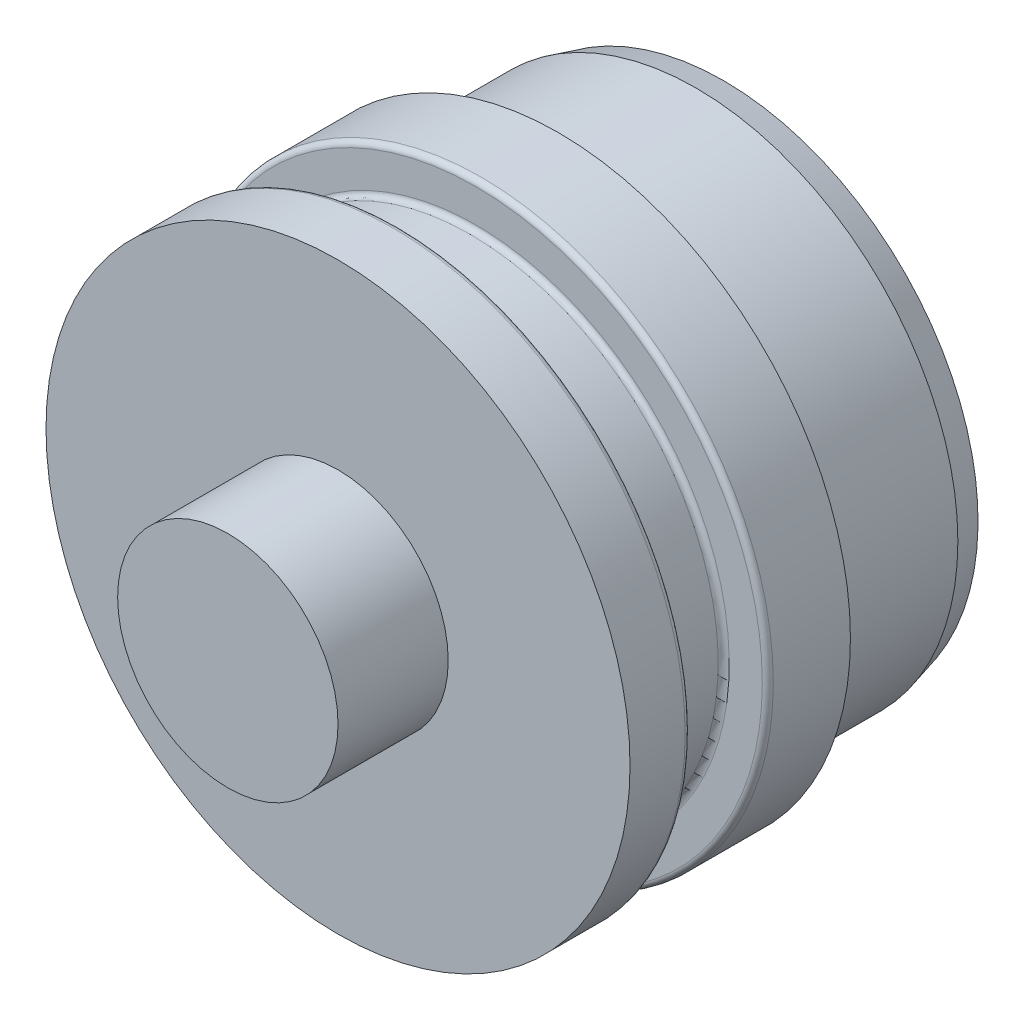
ISO-10303-21;
HEADER;
FILE_DESCRIPTION(('STEP AP214'),'2;1');
FILE_NAME('part.step','',(''),(''),'','','');
FILE_SCHEMA(('AUTOMOTIVE_DESIGN { 1 0 10303 214 1 1 1 1 }'));
ENDSEC;
DATA;
#1=APPLICATION_CONTEXT('core data for automotive mechanical design processes');
#2=APPLICATION_PROTOCOL_DEFINITION('international standard','automotive_design',2000,#1);
#3=PRODUCT_CONTEXT('',#1,'mechanical');
#4=PRODUCT('Part','Part','',(#3));
#5=PRODUCT_RELATED_PRODUCT_CATEGORY('part','',(#4));
#6=PRODUCT_DEFINITION_FORMATION('','',#4);
#7=PRODUCT_DEFINITION_CONTEXT('part definition',#1,'design');
#8=PRODUCT_DEFINITION('design','',#6,#7);
#9=PRODUCT_DEFINITION_SHAPE('','',#8);
#10=(LENGTH_UNIT() NAMED_UNIT(*) SI_UNIT(.MILLI.,.METRE.));
#11=(NAMED_UNIT(*) PLANE_ANGLE_UNIT() SI_UNIT($,.RADIAN.));
#12=(NAMED_UNIT(*) SI_UNIT($,.STERADIAN.) SOLID_ANGLE_UNIT());
#13=UNCERTAINTY_MEASURE_WITH_UNIT(LENGTH_MEASURE(1.E-05),#10,'distance_accuracy_value','');
#14=(GEOMETRIC_REPRESENTATION_CONTEXT(3) GLOBAL_UNCERTAINTY_ASSIGNED_CONTEXT((#13)) GLOBAL_UNIT_ASSIGNED_CONTEXT((#10,
#11,#12)) REPRESENTATION_CONTEXT('',''));
#15=CARTESIAN_POINT('',(0.,0.,0.));
#16=DIRECTION('',(0.,0.,1.));
#17=DIRECTION('',(1.,0.,0.));
#18=AXIS2_PLACEMENT_3D('',#15,#16,#17);
#19=CARTESIAN_POINT('',(0.,0.,-5.08));
#20=DIRECTION('',(0.,0.,-1.));
#21=DIRECTION('',(0.,1.,0.));
#22=AXIS2_PLACEMENT_3D('',#19,#20,#21);
#23=CYLINDRICAL_SURFACE('',#22,12.065);
#24=CARTESIAN_POINT('',(0.,0.,-16.51));
#25=DIRECTION('',(0.,0.,-1.));
#26=DIRECTION('',(0.,1.,0.));
#27=AXIS2_PLACEMENT_3D('',#24,#25,#26);
#28=CIRCLE('',#27,12.065);
#29=CARTESIAN_POINT('',(0.,12.065,-16.51));
#30=VERTEX_POINT('',#29);
#31=EDGE_CURVE('E99',#30,#30,#28,.F.);
#32=ORIENTED_EDGE('',*,*,#31,.T.);
#33=EDGE_LOOP('',(#32));
#34=FACE_BOUND('',#33,.T.);
#35=CARTESIAN_POINT('',(0.,0.,-10.16));
#36=DIRECTION('',(0.,0.,-1.));
#37=DIRECTION('',(0.,1.,0.));
#38=AXIS2_PLACEMENT_3D('',#35,#36,#37);
#39=CIRCLE('',#38,12.065);
#40=CARTESIAN_POINT('',(0.,12.065,-10.16));
#41=VERTEX_POINT('',#40);
#42=EDGE_CURVE('E123',#41,#41,#39,.T.);
#43=ORIENTED_EDGE('',*,*,#42,.T.);
#44=EDGE_LOOP('',(#43));
#45=FACE_BOUND('',#44,.T.);
#46=ADVANCED_FACE('F67',(#34,#45),#23,.T.);
#47=CARTESIAN_POINT('',(0.,12.065,-17.78));
#48=DIRECTION('',(0.,0.,-1.));
#49=DIRECTION('',(0.,1.,0.));
#50=AXIS2_PLACEMENT_3D('',#47,#48,#49);
#51=PLANE('',#50);
#52=CARTESIAN_POINT('',(0.,0.,-17.78));
#53=DIRECTION('',(0.,0.,-1.));
#54=DIRECTION('',(0.,1.,0.));
#55=AXIS2_PLACEMENT_3D('',#52,#53,#54);
#56=CIRCLE('',#55,11.7247045256125);
#57=CARTESIAN_POINT('',(0.,11.7247045256125,-17.78));
#58=VERTEX_POINT('',#57);
#59=EDGE_CURVE('E102',#58,#58,#56,.T.);
#60=ORIENTED_EDGE('',*,*,#59,.T.);
#61=EDGE_LOOP('',(#60));
#62=FACE_BOUND('',#61,.T.);
#63=CARTESIAN_POINT('',(0.,0.,-17.78));
#64=DIRECTION('',(0.,0.,-1.));
#65=DIRECTION('',(0.,1.,0.));
#66=AXIS2_PLACEMENT_3D('',#63,#64,#65);
#67=CIRCLE('',#66,6.731);
#68=CARTESIAN_POINT('',(0.,6.731,-17.78));
#69=VERTEX_POINT('',#68);
#70=EDGE_CURVE('E105',#69,#69,#67,.T.);
#71=ORIENTED_EDGE('',*,*,#70,.F.);
#72=EDGE_LOOP('',(#71));
#73=FACE_BOUND('',#72,.T.);
#74=ADVANCED_FACE('F144',(#62,#73),#51,.T.);
#75=CARTESIAN_POINT('',(0.,0.,-5.08));
#76=DIRECTION('',(0.,0.,-1.));
#77=DIRECTION('',(0.,1.,0.));
#78=AXIS2_PLACEMENT_3D('',#75,#76,#77);
#79=CYLINDRICAL_SURFACE('',#78,6.731);
#80=ORIENTED_EDGE('',*,*,#70,.T.);
#81=EDGE_LOOP('',(#80));
#82=FACE_BOUND('',#81,.T.);
#83=CARTESIAN_POINT('',(0.,0.,-5.08));
#84=DIRECTION('',(0.,0.,-1.));
#85=DIRECTION('',(0.,1.,0.));
#86=AXIS2_PLACEMENT_3D('',#83,#84,#85);
#87=CIRCLE('',#86,6.731);
#88=CARTESIAN_POINT('',(0.,6.731,-5.08));
#89=VERTEX_POINT('',#88);
#90=EDGE_CURVE('E108',#89,#89,#87,.T.);
#91=ORIENTED_EDGE('',*,*,#90,.F.);
#92=EDGE_LOOP('',(#91));
#93=FACE_BOUND('',#92,.T.);
#94=ADVANCED_FACE('F150',(#82,#93),#79,.F.);
#95=CARTESIAN_POINT('',(0.,6.731,-5.08));
#96=DIRECTION('',(0.,0.,-1.));
#97=DIRECTION('',(0.,1.,0.));
#98=AXIS2_PLACEMENT_3D('',#95,#96,#97);
#99=PLANE('',#98);
#100=ORIENTED_EDGE('',*,*,#90,.T.);
#101=EDGE_LOOP('',(#100));
#102=FACE_BOUND('',#101,.T.);
#103=ADVANCED_FACE('F199',(#102),#99,.T.);
#104=CARTESIAN_POINT('',(0.,5.08,5.08));
#105=DIRECTION('',(0.,0.,1.));
#106=DIRECTION('',(0.,-1.,0.));
#107=AXIS2_PLACEMENT_3D('',#104,#105,#106);
#108=PLANE('',#107);
#109=CARTESIAN_POINT('',(0.,0.,5.08));
#110=DIRECTION('',(0.,0.,-1.));
#111=DIRECTION('',(0.,1.,0.));
#112=AXIS2_PLACEMENT_3D('',#109,#110,#111);
#113=CIRCLE('',#112,5.08);
#114=CARTESIAN_POINT('',(0.,5.08,5.08));
#115=VERTEX_POINT('',#114);
#116=EDGE_CURVE('E111',#115,#115,#113,.T.);
#117=ORIENTED_EDGE('',*,*,#116,.F.);
#118=EDGE_LOOP('',(#117));
#119=FACE_BOUND('',#118,.T.);
#120=ADVANCED_FACE('F195',(#119),#108,.T.);
#121=CARTESIAN_POINT('',(0.,0.,-5.08));
#122=DIRECTION('',(0.,0.,-1.));
#123=DIRECTION('',(0.,1.,0.));
#124=AXIS2_PLACEMENT_3D('',#121,#122,#123);
#125=CYLINDRICAL_SURFACE('',#124,5.08);
#126=ORIENTED_EDGE('',*,*,#116,.T.);
#127=EDGE_LOOP('',(#126));
#128=FACE_BOUND('',#127,.T.);
#129=CARTESIAN_POINT('',(0.,0.,0.));
#130=DIRECTION('',(0.,0.,-1.));
#131=DIRECTION('',(0.,1.,0.));
#132=AXIS2_PLACEMENT_3D('',#129,#130,#131);
#133=CIRCLE('',#132,5.08);
#134=CARTESIAN_POINT('',(0.,5.08,0.));
#135=VERTEX_POINT('',#134);
#136=EDGE_CURVE('E114',#135,#135,#133,.T.);
#137=ORIENTED_EDGE('',*,*,#136,.F.);
#138=EDGE_LOOP('',(#137));
#139=FACE_BOUND('',#138,.T.);
#140=ADVANCED_FACE('F191',(#128,#139),#125,.T.);
#141=CARTESIAN_POINT('',(0.,5.08,0.));
#142=DIRECTION('',(0.,0.,1.));
#143=DIRECTION('',(0.,-1.,0.));
#144=AXIS2_PLACEMENT_3D('',#141,#142,#143);
#145=PLANE('',#144);
#146=ORIENTED_EDGE('',*,*,#136,.T.);
#147=EDGE_LOOP('',(#146));
#148=FACE_BOUND('',#147,.T.);
#149=CARTESIAN_POINT('',(0.,0.,0.));
#150=DIRECTION('',(0.,0.,-1.));
#151=DIRECTION('',(0.,1.,0.));
#152=AXIS2_PLACEMENT_3D('',#149,#150,#151);
#153=CIRCLE('',#152,13.462);
#154=CARTESIAN_POINT('',(0.,13.462,0.));
#155=VERTEX_POINT('',#154);
#156=EDGE_CURVE('E117',#155,#155,#153,.T.);
#157=ORIENTED_EDGE('',*,*,#156,.F.);
#158=EDGE_LOOP('',(#157));
#159=FACE_BOUND('',#158,.T.);
#160=ADVANCED_FACE('F187',(#148,#159),#145,.T.);
#161=CARTESIAN_POINT('',(0.,0.,-5.08));
#162=DIRECTION('',(0.,0.,-1.));
#163=DIRECTION('',(0.,1.,0.));
#164=AXIS2_PLACEMENT_3D('',#161,#162,#163);
#165=CYLINDRICAL_SURFACE('',#164,13.462);
#166=CARTESIAN_POINT('',(0.,0.,-2.54));
#167=DIRECTION('',(0.,0.,-1.));
#168=DIRECTION('',(0.,1.,0.));
#169=AXIS2_PLACEMENT_3D('',#166,#167,#168);
#170=CIRCLE('',#169,13.462);
#171=CARTESIAN_POINT('',(0.,13.462,-2.54));
#172=VERTEX_POINT('',#171);
#173=EDGE_CURVE('E90',#172,#172,#170,.F.);
#174=ORIENTED_EDGE('',*,*,#173,.T.);
#175=EDGE_LOOP('',(#174));
#176=FACE_BOUND('',#175,.T.);
#177=ORIENTED_EDGE('',*,*,#156,.T.);
#178=EDGE_LOOP('',(#177));
#179=FACE_BOUND('',#178,.T.);
#180=ADVANCED_FACE('F181',(#176,#179),#165,.T.);
#181=CARTESIAN_POINT('',(0.,13.462,-2.794));
#182=DIRECTION('',(0.,0.,-1.));
#183=DIRECTION('',(0.,1.,0.));
#184=AXIS2_PLACEMENT_3D('',#181,#182,#183);
#185=PLANE('',#184);
#186=CARTESIAN_POINT('',(0.,0.,-2.794));
#187=DIRECTION('',(0.,0.,-1.));
#188=DIRECTION('',(0.,1.,0.));
#189=AXIS2_PLACEMENT_3D('',#186,#187,#188);
#190=CIRCLE('',#189,13.208);
#191=CARTESIAN_POINT('',(0.,13.208,-2.794));
#192=VERTEX_POINT('',#191);
#193=EDGE_CURVE('E93',#192,#192,#190,.T.);
#194=ORIENTED_EDGE('',*,*,#193,.T.);
#195=EDGE_LOOP('',(#194));
#196=FACE_BOUND('',#195,.T.);
#197=CARTESIAN_POINT('',(0.,0.,-2.794));
#198=DIRECTION('',(0.,0.,-1.));
#199=DIRECTION('',(0.,1.,0.));
#200=AXIS2_PLACEMENT_3D('',#197,#198,#199);
#201=CIRCLE('',#200,11.684);
#202=CARTESIAN_POINT('',(0.,11.684,-2.794));
#203=VERTEX_POINT('',#202);
#204=EDGE_CURVE('E96',#203,#203,#201,.F.);
#205=ORIENTED_EDGE('',*,*,#204,.T.);
#206=EDGE_LOOP('',(#205));
#207=FACE_BOUND('',#206,.T.);
#208=ADVANCED_FACE('F173',(#196,#207),#185,.T.);
#209=CARTESIAN_POINT('',(0.,0.,-5.08));
#210=DIRECTION('',(0.,0.,-1.));
#211=DIRECTION('',(0.,1.,0.));
#212=AXIS2_PLACEMENT_3D('',#209,#210,#211);
#213=CYLINDRICAL_SURFACE('',#212,11.43);
#214=CARTESIAN_POINT('',(0.,0.,-3.048));
#215=DIRECTION('',(0.,0.,-1.));
#216=DIRECTION('',(0.,1.,0.));
#217=AXIS2_PLACEMENT_3D('',#214,#215,#216);
#218=CIRCLE('',#217,11.43);
#219=CARTESIAN_POINT('',(0.,11.43,-3.048));
#220=VERTEX_POINT('',#219);
#221=EDGE_CURVE('E82',#220,#220,#218,.T.);
#222=ORIENTED_EDGE('',*,*,#221,.T.);
#223=EDGE_LOOP('',(#222));
#224=FACE_BOUND('',#223,.T.);
#225=CARTESIAN_POINT('',(0.,0.,-6.096));
#226=DIRECTION('',(0.,0.,1.));
#227=DIRECTION('',(0.,-1.,0.));
#228=AXIS2_PLACEMENT_3D('',#225,#226,#227);
#229=CIRCLE('',#228,11.43);
#230=CARTESIAN_POINT('',(0.,-11.43,-6.096));
#231=VERTEX_POINT('',#230);
#232=EDGE_CURVE('E87',#231,#231,#229,.T.);
#233=ORIENTED_EDGE('',*,*,#232,.T.);
#234=EDGE_LOOP('',(#233));
#235=FACE_BOUND('',#234,.T.);
#236=ADVANCED_FACE('F171',(#224,#235),#213,.T.);
#237=CARTESIAN_POINT('',(0.,11.43,-6.35));
#238=DIRECTION('',(0.,0.,1.));
#239=DIRECTION('',(0.,-1.,0.));
#240=AXIS2_PLACEMENT_3D('',#237,#238,#239);
#241=PLANE('',#240);
#242=CARTESIAN_POINT('',(0.,0.,-6.35));
#243=DIRECTION('',(0.,0.,1.));
#244=DIRECTION('',(0.,-1.,0.));
#245=AXIS2_PLACEMENT_3D('',#242,#243,#244);
#246=CIRCLE('',#245,11.684);
#247=CARTESIAN_POINT('',(0.,-11.684,-6.35));
#248=VERTEX_POINT('',#247);
#249=EDGE_CURVE('E74',#248,#248,#246,.F.);
#250=ORIENTED_EDGE('',*,*,#249,.T.);
#251=EDGE_LOOP('',(#250));
#252=FACE_BOUND('',#251,.T.);
#253=CARTESIAN_POINT('',(0.,0.,-6.35));
#254=DIRECTION('',(0.,0.,1.));
#255=DIRECTION('',(0.,-1.,0.));
#256=AXIS2_PLACEMENT_3D('',#253,#254,#255);
#257=CIRCLE('',#256,13.208);
#258=CARTESIAN_POINT('',(0.,-13.208,-6.35));
#259=VERTEX_POINT('',#258);
#260=EDGE_CURVE('E78',#259,#259,#257,.T.);
#261=ORIENTED_EDGE('',*,*,#260,.T.);
#262=EDGE_LOOP('',(#261));
#263=FACE_BOUND('',#262,.T.);
#264=ADVANCED_FACE('F141',(#252,#263),#241,.T.);
#265=CARTESIAN_POINT('',(0.,0.,-5.08));
#266=DIRECTION('',(0.,0.,-1.));
#267=DIRECTION('',(0.,1.,0.));
#268=AXIS2_PLACEMENT_3D('',#265,#266,#267);
#269=CYLINDRICAL_SURFACE('',#268,13.462);
#270=CARTESIAN_POINT('',(0.,0.,-6.604));
#271=DIRECTION('',(0.,0.,1.));
#272=DIRECTION('',(0.,-1.,0.));
#273=AXIS2_PLACEMENT_3D('',#270,#271,#272);
#274=CIRCLE('',#273,13.462);
#275=CARTESIAN_POINT('',(0.,-13.462,-6.604));
#276=VERTEX_POINT('',#275);
#277=EDGE_CURVE('E11',#276,#276,#274,.F.);
#278=ORIENTED_EDGE('',*,*,#277,.T.);
#279=EDGE_LOOP('',(#278));
#280=FACE_BOUND('',#279,.T.);
#281=CARTESIAN_POINT('',(0.,0.,-10.16));
#282=DIRECTION('',(0.,0.,-1.));
#283=DIRECTION('',(0.,1.,0.));
#284=AXIS2_PLACEMENT_3D('',#281,#282,#283);
#285=CIRCLE('',#284,13.462);
#286=CARTESIAN_POINT('',(0.,13.462,-10.16));
#287=VERTEX_POINT('',#286);
#288=EDGE_CURVE('E120',#287,#287,#285,.T.);
#289=ORIENTED_EDGE('',*,*,#288,.F.);
#290=EDGE_LOOP('',(#289));
#291=FACE_BOUND('',#290,.T.);
#292=ADVANCED_FACE('F131',(#280,#291),#269,.T.);
#293=CARTESIAN_POINT('',(0.,13.462,-10.16));
#294=DIRECTION('',(0.,0.,-1.));
#295=DIRECTION('',(0.,1.,0.));
#296=AXIS2_PLACEMENT_3D('',#293,#294,#295);
#297=PLANE('',#296);
#298=ORIENTED_EDGE('',*,*,#288,.T.);
#299=EDGE_LOOP('',(#298));
#300=FACE_BOUND('',#299,.T.);
#301=ORIENTED_EDGE('',*,*,#42,.F.);
#302=EDGE_LOOP('',(#301));
#303=FACE_BOUND('',#302,.T.);
#304=ADVANCED_FACE('F128',(#300,#303),#297,.T.);
#305=CARTESIAN_POINT('',(0.,0.,-17.78));
#306=DIRECTION('',(0.,0.,1.));
#307=DIRECTION('',(0.,-1.,0.));
#308=AXIS2_PLACEMENT_3D('',#305,#306,#307);
#309=CONICAL_SURFACE('',#308,11.7247045256125,0.261799387799146);
#310=ORIENTED_EDGE('',*,*,#31,.F.);
#311=EDGE_LOOP('',(#310));
#312=FACE_BOUND('',#311,.T.);
#313=ORIENTED_EDGE('',*,*,#59,.F.);
#314=EDGE_LOOP('',(#313));
#315=FACE_BOUND('',#314,.T.);
#316=ADVANCED_FACE('F130',(#312,#315),#309,.T.);
#317=CARTESIAN_POINT('',(0.,0.,-2.54));
#318=DIRECTION('',(0.,0.,-1.));
#319=DIRECTION('',(0.,1.,0.));
#320=AXIS2_PLACEMENT_3D('',#317,#318,#319);
#321=TOROIDAL_SURFACE('',#320,13.208,0.254);
#322=ORIENTED_EDGE('',*,*,#173,.F.);
#323=EDGE_LOOP('',(#322));
#324=FACE_BOUND('',#323,.T.);
#325=ORIENTED_EDGE('',*,*,#193,.F.);
#326=EDGE_LOOP('',(#325));
#327=FACE_BOUND('',#326,.T.);
#328=ADVANCED_FACE('F138',(#324,#327),#321,.T.);
#329=CARTESIAN_POINT('',(0.,0.,-3.048));
#330=DIRECTION('',(0.,0.,-1.));
#331=DIRECTION('',(0.,1.,0.));
#332=AXIS2_PLACEMENT_3D('',#329,#330,#331);
#333=TOROIDAL_SURFACE('',#332,11.684,0.254);
#334=ORIENTED_EDGE('',*,*,#204,.F.);
#335=EDGE_LOOP('',(#334));
#336=FACE_BOUND('',#335,.T.);
#337=ORIENTED_EDGE('',*,*,#221,.F.);
#338=EDGE_LOOP('',(#337));
#339=FACE_BOUND('',#338,.T.);
#340=ADVANCED_FACE('F157',(#336,#339),#333,.F.);
#341=CARTESIAN_POINT('',(0.,0.,-6.096));
#342=DIRECTION('',(0.,0.,1.));
#343=DIRECTION('',(0.,-1.,0.));
#344=AXIS2_PLACEMENT_3D('',#341,#342,#343);
#345=TOROIDAL_SURFACE('',#344,11.684,0.254);
#346=ORIENTED_EDGE('',*,*,#232,.F.);
#347=EDGE_LOOP('',(#346));
#348=FACE_BOUND('',#347,.T.);
#349=ORIENTED_EDGE('',*,*,#249,.F.);
#350=EDGE_LOOP('',(#349));
#351=FACE_BOUND('',#350,.T.);
#352=ADVANCED_FACE('F160',(#348,#351),#345,.F.);
#353=CARTESIAN_POINT('',(0.,0.,-6.604));
#354=DIRECTION('',(0.,0.,1.));
#355=DIRECTION('',(0.,-1.,0.));
#356=AXIS2_PLACEMENT_3D('',#353,#354,#355);
#357=TOROIDAL_SURFACE('',#356,13.208,0.254);
#358=ORIENTED_EDGE('',*,*,#260,.F.);
#359=EDGE_LOOP('',(#358));
#360=FACE_BOUND('',#359,.T.);
#361=ORIENTED_EDGE('',*,*,#277,.F.);
#362=EDGE_LOOP('',(#361));
#363=FACE_BOUND('',#362,.T.);
#364=ADVANCED_FACE('F69',(#360,#363),#357,.T.);
#365=CLOSED_SHELL('',(#46,#74,#94,#103,#120,#140,#160,#180,#208,#236,#264,#292,#304,#316,#328,
#340,#352,#364));
#366=MANIFOLD_SOLID_BREP('B2',#365);
#367=ADVANCED_BREP_SHAPE_REPRESENTATION('',(#18,#366),#14);
#368=SHAPE_DEFINITION_REPRESENTATION(#9,#367);
ENDSEC;
END-ISO-10303-21;
